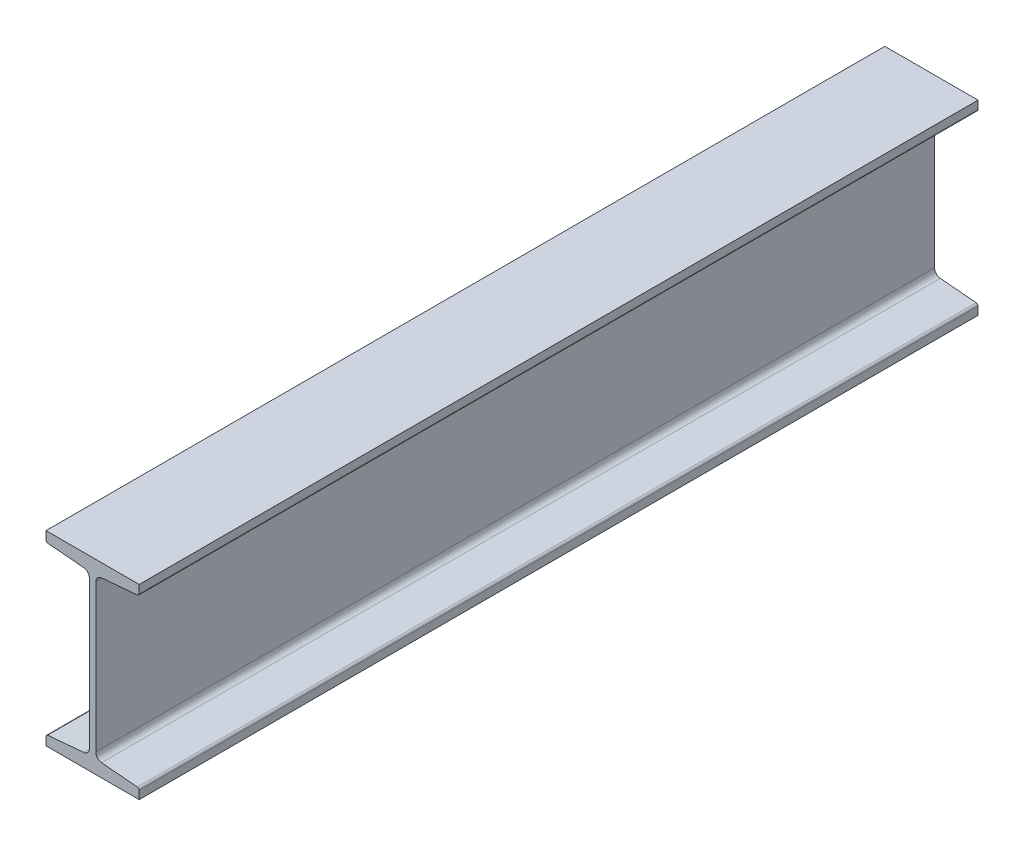
ISO-10303-21;
HEADER;
FILE_DESCRIPTION(('STEP AP214'),'2;1');
FILE_NAME('part.step','',(''),(''),'','','');
FILE_SCHEMA(('AUTOMOTIVE_DESIGN { 1 0 10303 214 1 1 1 1 }'));
ENDSEC;
DATA;
#1=APPLICATION_CONTEXT('core data for automotive mechanical design processes');
#2=APPLICATION_PROTOCOL_DEFINITION('international standard','automotive_design',2000,#1);
#3=PRODUCT_CONTEXT('',#1,'mechanical');
#4=PRODUCT('Part','Part','',(#3));
#5=PRODUCT_RELATED_PRODUCT_CATEGORY('part','',(#4));
#6=PRODUCT_DEFINITION_FORMATION('','',#4);
#7=PRODUCT_DEFINITION_CONTEXT('part definition',#1,'design');
#8=PRODUCT_DEFINITION('design','',#6,#7);
#9=PRODUCT_DEFINITION_SHAPE('','',#8);
#10=(LENGTH_UNIT() NAMED_UNIT(*) SI_UNIT(.MILLI.,.METRE.));
#11=(NAMED_UNIT(*) PLANE_ANGLE_UNIT() SI_UNIT($,.RADIAN.));
#12=(NAMED_UNIT(*) SI_UNIT($,.STERADIAN.) SOLID_ANGLE_UNIT());
#13=UNCERTAINTY_MEASURE_WITH_UNIT(LENGTH_MEASURE(1.E-05),#10,'distance_accuracy_value','');
#14=(GEOMETRIC_REPRESENTATION_CONTEXT(3) GLOBAL_UNCERTAINTY_ASSIGNED_CONTEXT((#13)) GLOBAL_UNIT_ASSIGNED_CONTEXT((#10,
#11,#12)) REPRESENTATION_CONTEXT('',''));
#15=CARTESIAN_POINT('',(0.,0.,0.));
#16=DIRECTION('',(0.,0.,1.));
#17=DIRECTION('',(1.,0.,0.));
#18=AXIS2_PLACEMENT_3D('',#15,#16,#17);
#19=CARTESIAN_POINT('',(-50.8,-101.6,457.2));
#20=DIRECTION('',(1.,0.,0.));
#21=DIRECTION('',(0.,1.,0.));
#22=AXIS2_PLACEMENT_3D('',#19,#20,#21);
#23=PLANE('',#22);
#24=DIRECTION('',(0.,-1.,0.));
#25=VECTOR('',#24,1.);
#26=CARTESIAN_POINT('',(-50.8,-101.6,-457.2));
#27=LINE('',#26,#25);
#28=CARTESIAN_POINT('',(-50.8,-92.7833590047036,-457.2));
#29=VERTEX_POINT('',#28);
#30=CARTESIAN_POINT('',(-50.8,-101.6,-457.2));
#31=VERTEX_POINT('',#30);
#32=EDGE_CURVE('E215',#29,#31,#27,.T.);
#33=ORIENTED_EDGE('',*,*,#32,.T.);
#34=DIRECTION('',(0.,0.,-1.));
#35=VECTOR('',#34,1.);
#36=CARTESIAN_POINT('',(-50.8,-101.6,457.2));
#37=LINE('',#36,#35);
#38=CARTESIAN_POINT('',(-50.8,-101.6,457.2));
#39=VERTEX_POINT('',#38);
#40=EDGE_CURVE('E11',#39,#31,#37,.T.);
#41=ORIENTED_EDGE('',*,*,#40,.F.);
#42=DIRECTION('',(0.,-1.,0.));
#43=VECTOR('',#42,1.);
#44=CARTESIAN_POINT('',(-50.8,-101.6,457.2));
#45=LINE('',#44,#43);
#46=CARTESIAN_POINT('',(-50.8,-92.7833590047036,457.2));
#47=VERTEX_POINT('',#46);
#48=EDGE_CURVE('E273',#47,#39,#45,.T.);
#49=ORIENTED_EDGE('',*,*,#48,.F.);
#50=DIRECTION('',(0.,0.,-1.));
#51=VECTOR('',#50,1.);
#52=CARTESIAN_POINT('',(-50.8,-92.7833590047036,457.2));
#53=LINE('',#52,#51);
#54=EDGE_CURVE('E211',#47,#29,#53,.T.);
#55=ORIENTED_EDGE('',*,*,#54,.T.);
#56=EDGE_LOOP('',(#33,#41,#49,#55));
#57=FACE_BOUND('',#56,.T.);
#58=ADVANCED_FACE('F41',(#57),#23,.F.);
#59=CARTESIAN_POINT('',(-50.8,-101.6,457.2));
#60=DIRECTION('',(0.,1.,0.));
#61=DIRECTION('',(-1.,0.,0.));
#62=AXIS2_PLACEMENT_3D('',#59,#60,#61);
#63=PLANE('',#62);
#64=DIRECTION('',(1.,0.,0.));
#65=VECTOR('',#64,1.);
#66=CARTESIAN_POINT('',(-50.8,-101.6,-457.2));
#67=LINE('',#66,#65);
#68=CARTESIAN_POINT('',(50.8,-101.6,-457.2));
#69=VERTEX_POINT('',#68);
#70=EDGE_CURVE('E219',#31,#69,#67,.T.);
#71=ORIENTED_EDGE('',*,*,#70,.T.);
#72=DIRECTION('',(0.,0.,-1.));
#73=VECTOR('',#72,1.);
#74=CARTESIAN_POINT('',(50.8,-101.6,457.2));
#75=LINE('',#74,#73);
#76=CARTESIAN_POINT('',(50.8,-101.6,457.2));
#77=VERTEX_POINT('',#76);
#78=EDGE_CURVE('E50',#77,#69,#75,.T.);
#79=ORIENTED_EDGE('',*,*,#78,.F.);
#80=DIRECTION('',(1.,0.,0.));
#81=VECTOR('',#80,1.);
#82=CARTESIAN_POINT('',(-50.8,-101.6,457.2));
#83=LINE('',#82,#81);
#84=EDGE_CURVE('E137',#39,#77,#83,.T.);
#85=ORIENTED_EDGE('',*,*,#84,.F.);
#86=ORIENTED_EDGE('',*,*,#40,.T.);
#87=EDGE_LOOP('',(#71,#79,#85,#86));
#88=FACE_BOUND('',#87,.T.);
#89=ADVANCED_FACE('F438',(#88),#63,.F.);
#90=CARTESIAN_POINT('',(50.8,-101.6,457.2));
#91=DIRECTION('',(-1.,0.,0.));
#92=DIRECTION('',(0.,-1.,0.));
#93=AXIS2_PLACEMENT_3D('',#90,#91,#92);
#94=PLANE('',#93);
#95=DIRECTION('',(0.,1.,0.));
#96=VECTOR('',#95,1.);
#97=CARTESIAN_POINT('',(50.8,-101.6,-457.2));
#98=LINE('',#97,#96);
#99=CARTESIAN_POINT('',(50.8,-92.7833590047036,-457.2));
#100=VERTEX_POINT('',#99);
#101=EDGE_CURVE('E222',#69,#100,#98,.T.);
#102=ORIENTED_EDGE('',*,*,#101,.T.);
#103=DIRECTION('',(0.,0.,-1.));
#104=VECTOR('',#103,1.);
#105=CARTESIAN_POINT('',(50.8,-92.7833590047036,457.2));
#106=LINE('',#105,#104);
#107=CARTESIAN_POINT('',(50.8,-92.7833590047036,457.2));
#108=VERTEX_POINT('',#107);
#109=EDGE_CURVE('E332',#108,#100,#106,.T.);
#110=ORIENTED_EDGE('',*,*,#109,.F.);
#111=DIRECTION('',(0.,1.,0.));
#112=VECTOR('',#111,1.);
#113=CARTESIAN_POINT('',(50.8,-101.6,457.2));
#114=LINE('',#113,#112);
#115=EDGE_CURVE('E343',#77,#108,#114,.T.);
#116=ORIENTED_EDGE('',*,*,#115,.F.);
#117=ORIENTED_EDGE('',*,*,#78,.T.);
#118=EDGE_LOOP('',(#102,#110,#116,#117));
#119=FACE_BOUND('',#118,.T.);
#120=ADVANCED_FACE('F341',(#119),#94,.F.);
#121=CARTESIAN_POINT('',(48.641,-92.7833590047036,457.2));
#122=DIRECTION('',(0.,0.,-1.));
#123=DIRECTION('',(-1.,0.,0.));
#124=AXIS2_PLACEMENT_3D('',#121,#122,#123);
#125=CYLINDRICAL_SURFACE('',#124,2.159);
#126=CARTESIAN_POINT('',(48.641,-92.7833590047036,-457.2));
#127=DIRECTION('',(0.,0.,1.));
#128=DIRECTION('',(1.,0.,0.));
#129=AXIS2_PLACEMENT_3D('',#126,#127,#128);
#130=CIRCLE('',#129,2.159);
#131=CARTESIAN_POINT('',(48.8291692485922,-90.6325746515236,-457.2));
#132=VERTEX_POINT('',#131);
#133=EDGE_CURVE('E225',#100,#132,#130,.T.);
#134=ORIENTED_EDGE('',*,*,#133,.T.);
#135=DIRECTION('',(0.,0.,-1.));
#136=VECTOR('',#135,1.);
#137=CARTESIAN_POINT('',(48.8291692485922,-90.6325746515236,457.2));
#138=LINE('',#137,#136);
#139=CARTESIAN_POINT('',(48.8291692485922,-90.6325746515236,457.2));
#140=VERTEX_POINT('',#139);
#141=EDGE_CURVE('E328',#140,#132,#138,.T.);
#142=ORIENTED_EDGE('',*,*,#141,.F.);
#143=CARTESIAN_POINT('',(48.641,-92.7833590047036,457.2));
#144=DIRECTION('',(0.,0.,1.));
#145=DIRECTION('',(1.,0.,0.));
#146=AXIS2_PLACEMENT_3D('',#143,#144,#145);
#147=CIRCLE('',#146,2.159);
#148=EDGE_CURVE('E362',#108,#140,#147,.T.);
#149=ORIENTED_EDGE('',*,*,#148,.F.);
#150=ORIENTED_EDGE('',*,*,#109,.T.);
#151=EDGE_LOOP('',(#134,#142,#149,#150));
#152=FACE_BOUND('',#151,.T.);
#153=ADVANCED_FACE('F352',(#152),#125,.T.);
#154=CARTESIAN_POINT('',(48.8291692485922,-90.6325746515236,457.2));
#155=DIRECTION('',(-0.0871557427476509,-0.996194698091746,0.));
#156=DIRECTION('',(0.996194698091746,-0.0871557427476509,0.));
#157=AXIS2_PLACEMENT_3D('',#154,#155,#156);
#158=PLANE('',#157);
#159=DIRECTION('',(-0.996194698091746,0.0871557427476509,0.));
#160=VECTOR('',#159,1.);
#161=CARTESIAN_POINT('',(48.8291692485922,-90.6325746515236,-457.2));
#162=LINE('',#161,#160);
#163=CARTESIAN_POINT('',(9.72517216037082,-87.2114182077537,-457.2));
#164=VERTEX_POINT('',#163);
#165=EDGE_CURVE('E228',#132,#164,#162,.T.);
#166=ORIENTED_EDGE('',*,*,#165,.T.);
#167=DIRECTION('',(0.,0.,-1.));
#168=VECTOR('',#167,1.);
#169=CARTESIAN_POINT('',(9.72517216037082,-87.2114182077537,457.2));
#170=LINE('',#169,#168);
#171=CARTESIAN_POINT('',(9.72517216037082,-87.2114182077537,457.2));
#172=VERTEX_POINT('',#171);
#173=EDGE_CURVE('E324',#172,#164,#170,.T.);
#174=ORIENTED_EDGE('',*,*,#173,.F.);
#175=DIRECTION('',(-0.996194698091746,0.0871557427476509,0.));
#176=VECTOR('',#175,1.);
#177=CARTESIAN_POINT('',(48.8291692485922,-90.6325746515236,457.2));
#178=LINE('',#177,#176);
#179=EDGE_CURVE('E358',#140,#172,#178,.T.);
#180=ORIENTED_EDGE('',*,*,#179,.F.);
#181=ORIENTED_EDGE('',*,*,#141,.T.);
#182=EDGE_LOOP('',(#166,#174,#180,#181));
#183=FACE_BOUND('',#182,.T.);
#184=ADVANCED_FACE('F356',(#183),#158,.F.);
#185=CARTESIAN_POINT('',(10.3251,-80.354211622909,457.2));
#186=DIRECTION('',(0.,0.,-1.));
#187=DIRECTION('',(-1.,0.,0.));
#188=AXIS2_PLACEMENT_3D('',#185,#186,#187);
#189=CYLINDRICAL_SURFACE('',#188,6.88340000000002);
#190=CARTESIAN_POINT('',(10.3251,-80.354211622909,-457.2));
#191=DIRECTION('',(0.,0.,-1.));
#192=DIRECTION('',(-1.,0.,0.));
#193=AXIS2_PLACEMENT_3D('',#190,#191,#192);
#194=CIRCLE('',#193,6.88340000000002);
#195=CARTESIAN_POINT('',(3.44169999999998,-80.354211622909,-457.2));
#196=VERTEX_POINT('',#195);
#197=EDGE_CURVE('E231',#164,#196,#194,.T.);
#198=ORIENTED_EDGE('',*,*,#197,.T.);
#199=DIRECTION('',(0.,0.,-1.));
#200=VECTOR('',#199,1.);
#201=CARTESIAN_POINT('',(3.44169999999998,-80.354211622909,457.2));
#202=LINE('',#201,#200);
#203=CARTESIAN_POINT('',(3.44169999999998,-80.354211622909,457.2));
#204=VERTEX_POINT('',#203);
#205=EDGE_CURVE('E320',#204,#196,#202,.T.);
#206=ORIENTED_EDGE('',*,*,#205,.F.);
#207=CARTESIAN_POINT('',(10.3251,-80.354211622909,457.2));
#208=DIRECTION('',(0.,0.,-1.));
#209=DIRECTION('',(-1.,0.,0.));
#210=AXIS2_PLACEMENT_3D('',#207,#208,#209);
#211=CIRCLE('',#210,6.88340000000002);
#212=EDGE_CURVE('E361',#172,#204,#211,.T.);
#213=ORIENTED_EDGE('',*,*,#212,.F.);
#214=ORIENTED_EDGE('',*,*,#173,.T.);
#215=EDGE_LOOP('',(#198,#206,#213,#214));
#216=FACE_BOUND('',#215,.T.);
#217=ADVANCED_FACE('F451',(#216),#189,.F.);
#218=CARTESIAN_POINT('',(3.44170000000003,80.354211622909,457.2));
#219=DIRECTION('',(-1.,0.,0.));
#220=DIRECTION('',(0.,-1.,0.));
#221=AXIS2_PLACEMENT_3D('',#218,#219,#220);
#222=PLANE('',#221);
#223=DIRECTION('',(0.,1.,0.));
#224=VECTOR('',#223,1.);
#225=CARTESIAN_POINT('',(3.44170000000003,80.354211622909,-457.2));
#226=LINE('',#225,#224);
#227=CARTESIAN_POINT('',(3.44170000000003,80.354211622909,-457.2));
#228=VERTEX_POINT('',#227);
#229=EDGE_CURVE('E234',#196,#228,#226,.T.);
#230=ORIENTED_EDGE('',*,*,#229,.T.);
#231=DIRECTION('',(0.,0.,-1.));
#232=VECTOR('',#231,1.);
#233=CARTESIAN_POINT('',(3.44170000000003,80.354211622909,457.2));
#234=LINE('',#233,#232);
#235=CARTESIAN_POINT('',(3.44170000000003,80.354211622909,457.2));
#236=VERTEX_POINT('',#235);
#237=EDGE_CURVE('E316',#236,#228,#234,.T.);
#238=ORIENTED_EDGE('',*,*,#237,.F.);
#239=DIRECTION('',(0.,1.,0.));
#240=VECTOR('',#239,1.);
#241=CARTESIAN_POINT('',(3.44170000000003,80.354211622909,457.2));
#242=LINE('',#241,#240);
#243=EDGE_CURVE('E367',#204,#236,#242,.T.);
#244=ORIENTED_EDGE('',*,*,#243,.F.);
#245=ORIENTED_EDGE('',*,*,#205,.T.);
#246=EDGE_LOOP('',(#230,#238,#244,#245));
#247=FACE_BOUND('',#246,.T.);
#248=ADVANCED_FACE('F454',(#247),#222,.F.);
#249=CARTESIAN_POINT('',(10.3251,80.354211622909,457.2));
#250=DIRECTION('',(0.,0.,-1.));
#251=DIRECTION('',(-1.,0.,0.));
#252=AXIS2_PLACEMENT_3D('',#249,#250,#251);
#253=CYLINDRICAL_SURFACE('',#252,6.88340000000002);
#254=CARTESIAN_POINT('',(10.3251,80.354211622909,-457.2));
#255=DIRECTION('',(0.,0.,-1.));
#256=DIRECTION('',(1.,0.,0.));
#257=AXIS2_PLACEMENT_3D('',#254,#255,#256);
#258=CIRCLE('',#257,6.88340000000002);
#259=CARTESIAN_POINT('',(9.72517216037085,87.2114182077537,-457.2));
#260=VERTEX_POINT('',#259);
#261=EDGE_CURVE('E237',#228,#260,#258,.T.);
#262=ORIENTED_EDGE('',*,*,#261,.T.);
#263=DIRECTION('',(0.,0.,-1.));
#264=VECTOR('',#263,1.);
#265=CARTESIAN_POINT('',(9.72517216037085,87.2114182077537,457.2));
#266=LINE('',#265,#264);
#267=CARTESIAN_POINT('',(9.72517216037085,87.2114182077537,457.2));
#268=VERTEX_POINT('',#267);
#269=EDGE_CURVE('E312',#268,#260,#266,.T.);
#270=ORIENTED_EDGE('',*,*,#269,.F.);
#271=CARTESIAN_POINT('',(10.3251,80.354211622909,457.2));
#272=DIRECTION('',(0.,0.,-1.));
#273=DIRECTION('',(1.,0.,0.));
#274=AXIS2_PLACEMENT_3D('',#271,#272,#273);
#275=CIRCLE('',#274,6.88340000000002);
#276=EDGE_CURVE('E374',#236,#268,#275,.T.);
#277=ORIENTED_EDGE('',*,*,#276,.F.);
#278=ORIENTED_EDGE('',*,*,#237,.T.);
#279=EDGE_LOOP('',(#262,#270,#277,#278));
#280=FACE_BOUND('',#279,.T.);
#281=ADVANCED_FACE('F458',(#280),#253,.F.);
#282=CARTESIAN_POINT('',(48.8291692485922,90.6325746515235,457.2));
#283=DIRECTION('',(-0.0871557427476502,0.996194698091746,0.));
#284=DIRECTION('',(-0.996194698091746,-0.0871557427476502,0.));
#285=AXIS2_PLACEMENT_3D('',#282,#283,#284);
#286=PLANE('',#285);
#287=DIRECTION('',(0.996194698091746,0.0871557427476501,0.));
#288=VECTOR('',#287,1.);
#289=CARTESIAN_POINT('',(48.8291692485922,90.6325746515235,-457.2));
#290=LINE('',#289,#288);
#291=CARTESIAN_POINT('',(48.8291692485922,90.6325746515235,-457.2));
#292=VERTEX_POINT('',#291);
#293=EDGE_CURVE('E240',#260,#292,#290,.T.);
#294=ORIENTED_EDGE('',*,*,#293,.T.);
#295=DIRECTION('',(0.,0.,-1.));
#296=VECTOR('',#295,1.);
#297=CARTESIAN_POINT('',(48.8291692485922,90.6325746515235,457.2));
#298=LINE('',#297,#296);
#299=CARTESIAN_POINT('',(48.8291692485922,90.6325746515235,457.2));
#300=VERTEX_POINT('',#299);
#301=EDGE_CURVE('E308',#300,#292,#298,.T.);
#302=ORIENTED_EDGE('',*,*,#301,.F.);
#303=DIRECTION('',(0.996194698091746,0.0871557427476501,0.));
#304=VECTOR('',#303,1.);
#305=CARTESIAN_POINT('',(48.8291692485922,90.6325746515235,457.2));
#306=LINE('',#305,#304);
#307=EDGE_CURVE('E377',#268,#300,#306,.T.);
#308=ORIENTED_EDGE('',*,*,#307,.F.);
#309=ORIENTED_EDGE('',*,*,#269,.T.);
#310=EDGE_LOOP('',(#294,#302,#308,#309));
#311=FACE_BOUND('',#310,.T.);
#312=ADVANCED_FACE('F462',(#311),#286,.F.);
#313=CARTESIAN_POINT('',(48.641,92.7833590047036,457.2));
#314=DIRECTION('',(0.,0.,-1.));
#315=DIRECTION('',(-1.,0.,0.));
#316=AXIS2_PLACEMENT_3D('',#313,#314,#315);
#317=CYLINDRICAL_SURFACE('',#316,2.159);
#318=CARTESIAN_POINT('',(48.641,92.7833590047036,-457.2));
#319=DIRECTION('',(0.,0.,1.));
#320=DIRECTION('',(-1.,0.,0.));
#321=AXIS2_PLACEMENT_3D('',#318,#319,#320);
#322=CIRCLE('',#321,2.159);
#323=CARTESIAN_POINT('',(50.8,92.7833590047036,-457.2));
#324=VERTEX_POINT('',#323);
#325=EDGE_CURVE('E243',#292,#324,#322,.T.);
#326=ORIENTED_EDGE('',*,*,#325,.T.);
#327=DIRECTION('',(0.,0.,-1.));
#328=VECTOR('',#327,1.);
#329=CARTESIAN_POINT('',(50.8,92.7833590047036,457.2));
#330=LINE('',#329,#328);
#331=CARTESIAN_POINT('',(50.8,92.7833590047036,457.2));
#332=VERTEX_POINT('',#331);
#333=EDGE_CURVE('E304',#332,#324,#330,.T.);
#334=ORIENTED_EDGE('',*,*,#333,.F.);
#335=CARTESIAN_POINT('',(48.641,92.7833590047036,457.2));
#336=DIRECTION('',(0.,0.,1.));
#337=DIRECTION('',(-1.,0.,0.));
#338=AXIS2_PLACEMENT_3D('',#335,#336,#337);
#339=CIRCLE('',#338,2.159);
#340=EDGE_CURVE('E380',#300,#332,#339,.T.);
#341=ORIENTED_EDGE('',*,*,#340,.F.);
#342=ORIENTED_EDGE('',*,*,#301,.T.);
#343=EDGE_LOOP('',(#326,#334,#341,#342));
#344=FACE_BOUND('',#343,.T.);
#345=ADVANCED_FACE('F466',(#344),#317,.T.);
#346=CARTESIAN_POINT('',(50.8,101.6,457.2));
#347=DIRECTION('',(-1.,0.,0.));
#348=DIRECTION('',(0.,-1.,0.));
#349=AXIS2_PLACEMENT_3D('',#346,#347,#348);
#350=PLANE('',#349);
#351=DIRECTION('',(0.,1.,0.));
#352=VECTOR('',#351,1.);
#353=CARTESIAN_POINT('',(50.8,101.6,-457.2));
#354=LINE('',#353,#352);
#355=CARTESIAN_POINT('',(50.8,101.6,-457.2));
#356=VERTEX_POINT('',#355);
#357=EDGE_CURVE('E246',#324,#356,#354,.T.);
#358=ORIENTED_EDGE('',*,*,#357,.T.);
#359=DIRECTION('',(0.,0.,-1.));
#360=VECTOR('',#359,1.);
#361=CARTESIAN_POINT('',(50.8,101.6,457.2));
#362=LINE('',#361,#360);
#363=CARTESIAN_POINT('',(50.8,101.6,457.2));
#364=VERTEX_POINT('',#363);
#365=EDGE_CURVE('E300',#364,#356,#362,.T.);
#366=ORIENTED_EDGE('',*,*,#365,.F.);
#367=DIRECTION('',(0.,1.,0.));
#368=VECTOR('',#367,1.);
#369=CARTESIAN_POINT('',(50.8,101.6,457.2));
#370=LINE('',#369,#368);
#371=EDGE_CURVE('E383',#332,#364,#370,.T.);
#372=ORIENTED_EDGE('',*,*,#371,.F.);
#373=ORIENTED_EDGE('',*,*,#333,.T.);
#374=EDGE_LOOP('',(#358,#366,#372,#373));
#375=FACE_BOUND('',#374,.T.);
#376=ADVANCED_FACE('F470',(#375),#350,.F.);
#377=CARTESIAN_POINT('',(-50.8,101.6,457.2));
#378=DIRECTION('',(0.,-1.,0.));
#379=DIRECTION('',(0.,0.,-1.));
#380=AXIS2_PLACEMENT_3D('',#377,#378,#379);
#381=PLANE('',#380);
#382=DIRECTION('',(-1.,0.,0.));
#383=VECTOR('',#382,1.);
#384=CARTESIAN_POINT('',(-50.8,101.6,-457.2));
#385=LINE('',#384,#383);
#386=CARTESIAN_POINT('',(-50.8,101.6,-457.2));
#387=VERTEX_POINT('',#386);
#388=EDGE_CURVE('E249',#356,#387,#385,.T.);
#389=ORIENTED_EDGE('',*,*,#388,.T.);
#390=DIRECTION('',(0.,0.,-1.));
#391=VECTOR('',#390,1.);
#392=CARTESIAN_POINT('',(-50.8,101.6,457.2));
#393=LINE('',#392,#391);
#394=CARTESIAN_POINT('',(-50.8,101.6,457.2));
#395=VERTEX_POINT('',#394);
#396=EDGE_CURVE('E296',#395,#387,#393,.T.);
#397=ORIENTED_EDGE('',*,*,#396,.F.);
#398=DIRECTION('',(-1.,0.,0.));
#399=VECTOR('',#398,1.);
#400=CARTESIAN_POINT('',(-50.8,101.6,457.2));
#401=LINE('',#400,#399);
#402=EDGE_CURVE('E386',#364,#395,#401,.T.);
#403=ORIENTED_EDGE('',*,*,#402,.F.);
#404=ORIENTED_EDGE('',*,*,#365,.T.);
#405=EDGE_LOOP('',(#389,#397,#403,#404));
#406=FACE_BOUND('',#405,.T.);
#407=ADVANCED_FACE('F474',(#406),#381,.F.);
#408=CARTESIAN_POINT('',(-50.8,101.6,457.2));
#409=DIRECTION('',(1.,0.,0.));
#410=DIRECTION('',(0.,1.,0.));
#411=AXIS2_PLACEMENT_3D('',#408,#409,#410);
#412=PLANE('',#411);
#413=DIRECTION('',(0.,-1.,0.));
#414=VECTOR('',#413,1.);
#415=CARTESIAN_POINT('',(-50.8,101.6,-457.2));
#416=LINE('',#415,#414);
#417=CARTESIAN_POINT('',(-50.8,92.7833590047036,-457.2));
#418=VERTEX_POINT('',#417);
#419=EDGE_CURVE('E252',#387,#418,#416,.T.);
#420=ORIENTED_EDGE('',*,*,#419,.T.);
#421=DIRECTION('',(0.,0.,-1.));
#422=VECTOR('',#421,1.);
#423=CARTESIAN_POINT('',(-50.8,92.7833590047036,457.2));
#424=LINE('',#423,#422);
#425=CARTESIAN_POINT('',(-50.8,92.7833590047036,457.2));
#426=VERTEX_POINT('',#425);
#427=EDGE_CURVE('E292',#426,#418,#424,.T.);
#428=ORIENTED_EDGE('',*,*,#427,.F.);
#429=DIRECTION('',(0.,-1.,0.));
#430=VECTOR('',#429,1.);
#431=CARTESIAN_POINT('',(-50.8,101.6,457.2));
#432=LINE('',#431,#430);
#433=EDGE_CURVE('E389',#395,#426,#432,.T.);
#434=ORIENTED_EDGE('',*,*,#433,.F.);
#435=ORIENTED_EDGE('',*,*,#396,.T.);
#436=EDGE_LOOP('',(#420,#428,#434,#435));
#437=FACE_BOUND('',#436,.T.);
#438=ADVANCED_FACE('F478',(#437),#412,.F.);
#439=CARTESIAN_POINT('',(-48.641,92.7833590047036,457.2));
#440=DIRECTION('',(0.,0.,-1.));
#441=DIRECTION('',(-1.,0.,0.));
#442=AXIS2_PLACEMENT_3D('',#439,#440,#441);
#443=CYLINDRICAL_SURFACE('',#442,2.159);
#444=CARTESIAN_POINT('',(-48.641,92.7833590047036,-457.2));
#445=DIRECTION('',(0.,0.,1.));
#446=DIRECTION('',(1.,0.,0.));
#447=AXIS2_PLACEMENT_3D('',#444,#445,#446);
#448=CIRCLE('',#447,2.159);
#449=CARTESIAN_POINT('',(-48.8291692485922,90.6325746515235,-457.2));
#450=VERTEX_POINT('',#449);
#451=EDGE_CURVE('E255',#418,#450,#448,.T.);
#452=ORIENTED_EDGE('',*,*,#451,.T.);
#453=DIRECTION('',(0.,0.,-1.));
#454=VECTOR('',#453,1.);
#455=CARTESIAN_POINT('',(-48.8291692485922,90.6325746515235,457.2));
#456=LINE('',#455,#454);
#457=CARTESIAN_POINT('',(-48.8291692485922,90.6325746515235,457.2));
#458=VERTEX_POINT('',#457);
#459=EDGE_CURVE('E288',#458,#450,#456,.T.);
#460=ORIENTED_EDGE('',*,*,#459,.F.);
#461=CARTESIAN_POINT('',(-48.641,92.7833590047036,457.2));
#462=DIRECTION('',(0.,0.,1.));
#463=DIRECTION('',(1.,0.,0.));
#464=AXIS2_PLACEMENT_3D('',#461,#462,#463);
#465=CIRCLE('',#464,2.159);
#466=EDGE_CURVE('E392',#426,#458,#465,.T.);
#467=ORIENTED_EDGE('',*,*,#466,.F.);
#468=ORIENTED_EDGE('',*,*,#427,.T.);
#469=EDGE_LOOP('',(#452,#460,#467,#468));
#470=FACE_BOUND('',#469,.T.);
#471=ADVANCED_FACE('F482',(#470),#443,.T.);
#472=CARTESIAN_POINT('',(-48.8291692485922,90.6325746515235,457.2));
#473=DIRECTION('',(0.0871557427476502,0.996194698091746,0.));
#474=DIRECTION('',(-0.996194698091746,0.0871557427476502,0.));
#475=AXIS2_PLACEMENT_3D('',#472,#473,#474);
#476=PLANE('',#475);
#477=DIRECTION('',(0.996194698091746,-0.0871557427476501,0.));
#478=VECTOR('',#477,1.);
#479=CARTESIAN_POINT('',(-48.8291692485922,90.6325746515235,-457.2));
#480=LINE('',#479,#478);
#481=CARTESIAN_POINT('',(-9.72517216037085,87.2114182077537,-457.2));
#482=VERTEX_POINT('',#481);
#483=EDGE_CURVE('E258',#450,#482,#480,.T.);
#484=ORIENTED_EDGE('',*,*,#483,.T.);
#485=DIRECTION('',(0.,0.,-1.));
#486=VECTOR('',#485,1.);
#487=CARTESIAN_POINT('',(-9.72517216037085,87.2114182077537,457.2));
#488=LINE('',#487,#486);
#489=CARTESIAN_POINT('',(-9.72517216037085,87.2114182077537,457.2));
#490=VERTEX_POINT('',#489);
#491=EDGE_CURVE('E284',#490,#482,#488,.T.);
#492=ORIENTED_EDGE('',*,*,#491,.F.);
#493=DIRECTION('',(0.996194698091746,-0.0871557427476501,0.));
#494=VECTOR('',#493,1.);
#495=CARTESIAN_POINT('',(-48.8291692485922,90.6325746515235,457.2));
#496=LINE('',#495,#494);
#497=EDGE_CURVE('E395',#458,#490,#496,.T.);
#498=ORIENTED_EDGE('',*,*,#497,.F.);
#499=ORIENTED_EDGE('',*,*,#459,.T.);
#500=EDGE_LOOP('',(#484,#492,#498,#499));
#501=FACE_BOUND('',#500,.T.);
#502=ADVANCED_FACE('F486',(#501),#476,.F.);
#503=CARTESIAN_POINT('',(-10.3251,80.354211622909,457.2));
#504=DIRECTION('',(0.,0.,-1.));
#505=DIRECTION('',(-1.,0.,0.));
#506=AXIS2_PLACEMENT_3D('',#503,#504,#505);
#507=CYLINDRICAL_SURFACE('',#506,6.88340000000002);
#508=CARTESIAN_POINT('',(-10.3251,80.354211622909,-457.2));
#509=DIRECTION('',(0.,0.,-1.));
#510=DIRECTION('',(-1.,0.,0.));
#511=AXIS2_PLACEMENT_3D('',#508,#509,#510);
#512=CIRCLE('',#511,6.88340000000002);
#513=CARTESIAN_POINT('',(-3.44170000000001,80.354211622909,-457.2));
#514=VERTEX_POINT('',#513);
#515=EDGE_CURVE('E261',#482,#514,#512,.T.);
#516=ORIENTED_EDGE('',*,*,#515,.T.);
#517=DIRECTION('',(0.,0.,-1.));
#518=VECTOR('',#517,1.);
#519=CARTESIAN_POINT('',(-3.44170000000001,80.354211622909,457.2));
#520=LINE('',#519,#518);
#521=CARTESIAN_POINT('',(-3.44170000000001,80.354211622909,457.2));
#522=VERTEX_POINT('',#521);
#523=EDGE_CURVE('E280',#522,#514,#520,.T.);
#524=ORIENTED_EDGE('',*,*,#523,.F.);
#525=CARTESIAN_POINT('',(-10.3251,80.354211622909,457.2));
#526=DIRECTION('',(0.,0.,-1.));
#527=DIRECTION('',(-1.,0.,0.));
#528=AXIS2_PLACEMENT_3D('',#525,#526,#527);
#529=CIRCLE('',#528,6.88340000000002);
#530=EDGE_CURVE('E398',#490,#522,#529,.T.);
#531=ORIENTED_EDGE('',*,*,#530,.F.);
#532=ORIENTED_EDGE('',*,*,#491,.T.);
#533=EDGE_LOOP('',(#516,#524,#531,#532));
#534=FACE_BOUND('',#533,.T.);
#535=ADVANCED_FACE('F419',(#534),#507,.F.);
#536=CARTESIAN_POINT('',(-3.44170000000003,80.354211622909,457.2));
#537=DIRECTION('',(1.,0.,0.));
#538=DIRECTION('',(0.,1.,0.));
#539=AXIS2_PLACEMENT_3D('',#536,#537,#538);
#540=PLANE('',#539);
#541=DIRECTION('',(0.,-1.,0.));
#542=VECTOR('',#541,1.);
#543=CARTESIAN_POINT('',(-3.44170000000003,80.354211622909,-457.2));
#544=LINE('',#543,#542);
#545=CARTESIAN_POINT('',(-3.4417,-80.354211622909,-457.2));
#546=VERTEX_POINT('',#545);
#547=EDGE_CURVE('E264',#514,#546,#544,.T.);
#548=ORIENTED_EDGE('',*,*,#547,.T.);
#549=DIRECTION('',(0.,0.,-1.));
#550=VECTOR('',#549,1.);
#551=CARTESIAN_POINT('',(-3.4417,-80.354211622909,457.2));
#552=LINE('',#551,#550);
#553=CARTESIAN_POINT('',(-3.4417,-80.354211622909,457.2));
#554=VERTEX_POINT('',#553);
#555=EDGE_CURVE('E203',#554,#546,#552,.T.);
#556=ORIENTED_EDGE('',*,*,#555,.F.);
#557=DIRECTION('',(0.,-1.,0.));
#558=VECTOR('',#557,1.);
#559=CARTESIAN_POINT('',(-3.44170000000003,80.354211622909,457.2));
#560=LINE('',#559,#558);
#561=EDGE_CURVE('E192',#522,#554,#560,.T.);
#562=ORIENTED_EDGE('',*,*,#561,.F.);
#563=ORIENTED_EDGE('',*,*,#523,.T.);
#564=EDGE_LOOP('',(#548,#556,#562,#563));
#565=FACE_BOUND('',#564,.T.);
#566=ADVANCED_FACE('F423',(#565),#540,.F.);
#567=CARTESIAN_POINT('',(-10.3251,-80.354211622909,457.2));
#568=DIRECTION('',(0.,0.,-1.));
#569=DIRECTION('',(-1.,0.,0.));
#570=AXIS2_PLACEMENT_3D('',#567,#568,#569);
#571=CYLINDRICAL_SURFACE('',#570,6.88340000000002);
#572=CARTESIAN_POINT('',(-10.3251,-80.354211622909,-457.2));
#573=DIRECTION('',(0.,0.,-1.));
#574=DIRECTION('',(1.,0.,0.));
#575=AXIS2_PLACEMENT_3D('',#572,#573,#574);
#576=CIRCLE('',#575,6.88340000000002);
#577=CARTESIAN_POINT('',(-9.72517216037082,-87.2114182077537,-457.2));
#578=VERTEX_POINT('',#577);
#579=EDGE_CURVE('E201',#546,#578,#576,.T.);
#580=ORIENTED_EDGE('',*,*,#579,.T.);
#581=DIRECTION('',(0.,0.,-1.));
#582=VECTOR('',#581,1.);
#583=CARTESIAN_POINT('',(-9.72517216037082,-87.2114182077537,457.2));
#584=LINE('',#583,#582);
#585=CARTESIAN_POINT('',(-9.72517216037082,-87.2114182077537,457.2));
#586=VERTEX_POINT('',#585);
#587=EDGE_CURVE('E198',#586,#578,#584,.T.);
#588=ORIENTED_EDGE('',*,*,#587,.F.);
#589=CARTESIAN_POINT('',(-10.3251,-80.354211622909,457.2));
#590=DIRECTION('',(0.,0.,-1.));
#591=DIRECTION('',(1.,0.,0.));
#592=AXIS2_PLACEMENT_3D('',#589,#590,#591);
#593=CIRCLE('',#592,6.88340000000002);
#594=EDGE_CURVE('E186',#554,#586,#593,.T.);
#595=ORIENTED_EDGE('',*,*,#594,.F.);
#596=ORIENTED_EDGE('',*,*,#555,.T.);
#597=EDGE_LOOP('',(#580,#588,#595,#596));
#598=FACE_BOUND('',#597,.T.);
#599=ADVANCED_FACE('F199',(#598),#571,.F.);
#600=CARTESIAN_POINT('',(-48.8291692485922,-90.6325746515236,457.2));
#601=DIRECTION('',(0.0871557427476509,-0.996194698091746,0.));
#602=DIRECTION('',(0.996194698091746,0.0871557427476509,0.));
#603=AXIS2_PLACEMENT_3D('',#600,#601,#602);
#604=PLANE('',#603);
#605=DIRECTION('',(-0.996194698091746,-0.0871557427476509,0.));
#606=VECTOR('',#605,1.);
#607=CARTESIAN_POINT('',(-48.8291692485922,-90.6325746515236,-457.2));
#608=LINE('',#607,#606);
#609=CARTESIAN_POINT('',(-48.8291692485922,-90.6325746515236,-457.2));
#610=VERTEX_POINT('',#609);
#611=EDGE_CURVE('E123',#578,#610,#608,.T.);
#612=ORIENTED_EDGE('',*,*,#611,.T.);
#613=DIRECTION('',(0.,0.,-1.));
#614=VECTOR('',#613,1.);
#615=CARTESIAN_POINT('',(-48.8291692485922,-90.6325746515236,457.2));
#616=LINE('',#615,#614);
#617=CARTESIAN_POINT('',(-48.8291692485922,-90.6325746515236,457.2));
#618=VERTEX_POINT('',#617);
#619=EDGE_CURVE('E204',#618,#610,#616,.T.);
#620=ORIENTED_EDGE('',*,*,#619,.F.);
#621=DIRECTION('',(-0.996194698091746,-0.0871557427476509,0.));
#622=VECTOR('',#621,1.);
#623=CARTESIAN_POINT('',(-48.8291692485922,-90.6325746515236,457.2));
#624=LINE('',#623,#622);
#625=EDGE_CURVE('E190',#586,#618,#624,.T.);
#626=ORIENTED_EDGE('',*,*,#625,.F.);
#627=ORIENTED_EDGE('',*,*,#587,.T.);
#628=EDGE_LOOP('',(#612,#620,#626,#627));
#629=FACE_BOUND('',#628,.T.);
#630=ADVANCED_FACE('F206',(#629),#604,.F.);
#631=CARTESIAN_POINT('',(-48.641,-92.7833590047036,457.2));
#632=DIRECTION('',(0.,0.,-1.));
#633=DIRECTION('',(-1.,0.,0.));
#634=AXIS2_PLACEMENT_3D('',#631,#632,#633);
#635=CYLINDRICAL_SURFACE('',#634,2.159);
#636=CARTESIAN_POINT('',(-48.641,-92.7833590047036,-457.2));
#637=DIRECTION('',(0.,0.,1.));
#638=DIRECTION('',(-1.,0.,0.));
#639=AXIS2_PLACEMENT_3D('',#636,#637,#638);
#640=CIRCLE('',#639,2.159);
#641=EDGE_CURVE('E129',#610,#29,#640,.T.);
#642=ORIENTED_EDGE('',*,*,#641,.T.);
#643=ORIENTED_EDGE('',*,*,#54,.F.);
#644=CARTESIAN_POINT('',(-48.641,-92.7833590047036,457.2));
#645=DIRECTION('',(0.,0.,1.));
#646=DIRECTION('',(-1.,0.,0.));
#647=AXIS2_PLACEMENT_3D('',#644,#645,#646);
#648=CIRCLE('',#647,2.159);
#649=EDGE_CURVE('E58',#618,#47,#648,.T.);
#650=ORIENTED_EDGE('',*,*,#649,.F.);
#651=ORIENTED_EDGE('',*,*,#619,.T.);
#652=EDGE_LOOP('',(#642,#643,#650,#651));
#653=FACE_BOUND('',#652,.T.);
#654=ADVANCED_FACE('F427',(#653),#635,.T.);
#655=CARTESIAN_POINT('',(-48.641,-92.7833590047036,457.2));
#656=DIRECTION('',(0.,0.,-1.));
#657=DIRECTION('',(-1.,0.,0.));
#658=AXIS2_PLACEMENT_3D('',#655,#656,#657);
#659=PLANE('',#658);
#660=ORIENTED_EDGE('',*,*,#48,.T.);
#661=ORIENTED_EDGE('',*,*,#84,.T.);
#662=ORIENTED_EDGE('',*,*,#115,.T.);
#663=ORIENTED_EDGE('',*,*,#148,.T.);
#664=ORIENTED_EDGE('',*,*,#179,.T.);
#665=ORIENTED_EDGE('',*,*,#212,.T.);
#666=ORIENTED_EDGE('',*,*,#243,.T.);
#667=ORIENTED_EDGE('',*,*,#276,.T.);
#668=ORIENTED_EDGE('',*,*,#307,.T.);
#669=ORIENTED_EDGE('',*,*,#340,.T.);
#670=ORIENTED_EDGE('',*,*,#371,.T.);
#671=ORIENTED_EDGE('',*,*,#402,.T.);
#672=ORIENTED_EDGE('',*,*,#433,.T.);
#673=ORIENTED_EDGE('',*,*,#466,.T.);
#674=ORIENTED_EDGE('',*,*,#497,.T.);
#675=ORIENTED_EDGE('',*,*,#530,.T.);
#676=ORIENTED_EDGE('',*,*,#561,.T.);
#677=ORIENTED_EDGE('',*,*,#594,.T.);
#678=ORIENTED_EDGE('',*,*,#625,.T.);
#679=ORIENTED_EDGE('',*,*,#649,.T.);
#680=EDGE_LOOP('',(#660,#661,#662,#663,#664,#665,#666,#667,#668,#669,#670,#671,#672,#673,#674,
#675,#676,#677,#678,#679));
#681=FACE_BOUND('',#680,.T.);
#682=ADVANCED_FACE('F188',(#681),#659,.F.);
#683=CARTESIAN_POINT('',(-48.641,-92.7833590047036,-457.2));
#684=DIRECTION('',(0.,0.,-1.));
#685=DIRECTION('',(-1.,0.,0.));
#686=AXIS2_PLACEMENT_3D('',#683,#684,#685);
#687=PLANE('',#686);
#688=ORIENTED_EDGE('',*,*,#32,.F.);
#689=ORIENTED_EDGE('',*,*,#641,.F.);
#690=ORIENTED_EDGE('',*,*,#611,.F.);
#691=ORIENTED_EDGE('',*,*,#579,.F.);
#692=ORIENTED_EDGE('',*,*,#547,.F.);
#693=ORIENTED_EDGE('',*,*,#515,.F.);
#694=ORIENTED_EDGE('',*,*,#483,.F.);
#695=ORIENTED_EDGE('',*,*,#451,.F.);
#696=ORIENTED_EDGE('',*,*,#419,.F.);
#697=ORIENTED_EDGE('',*,*,#388,.F.);
#698=ORIENTED_EDGE('',*,*,#357,.F.);
#699=ORIENTED_EDGE('',*,*,#325,.F.);
#700=ORIENTED_EDGE('',*,*,#293,.F.);
#701=ORIENTED_EDGE('',*,*,#261,.F.);
#702=ORIENTED_EDGE('',*,*,#229,.F.);
#703=ORIENTED_EDGE('',*,*,#197,.F.);
#704=ORIENTED_EDGE('',*,*,#165,.F.);
#705=ORIENTED_EDGE('',*,*,#133,.F.);
#706=ORIENTED_EDGE('',*,*,#101,.F.);
#707=ORIENTED_EDGE('',*,*,#70,.F.);
#708=EDGE_LOOP('',(#688,#689,#690,#691,#692,#693,#694,#695,#696,#697,#698,#699,#700,#701,#702,
#703,#704,#705,#706,#707));
#709=FACE_BOUND('',#708,.T.);
#710=ADVANCED_FACE('F347',(#709),#687,.T.);
#711=CLOSED_SHELL('',(#58,#89,#120,#153,#184,#217,#248,#281,#312,#345,#376,#407,#438,#471,#502,
#535,#566,#599,#630,#654,#682,#710));
#712=MANIFOLD_SOLID_BREP('B2',#711);
#713=ADVANCED_BREP_SHAPE_REPRESENTATION('',(#18,#712),#14);
#714=SHAPE_DEFINITION_REPRESENTATION(#9,#713);
ENDSEC;
END-ISO-10303-21;
